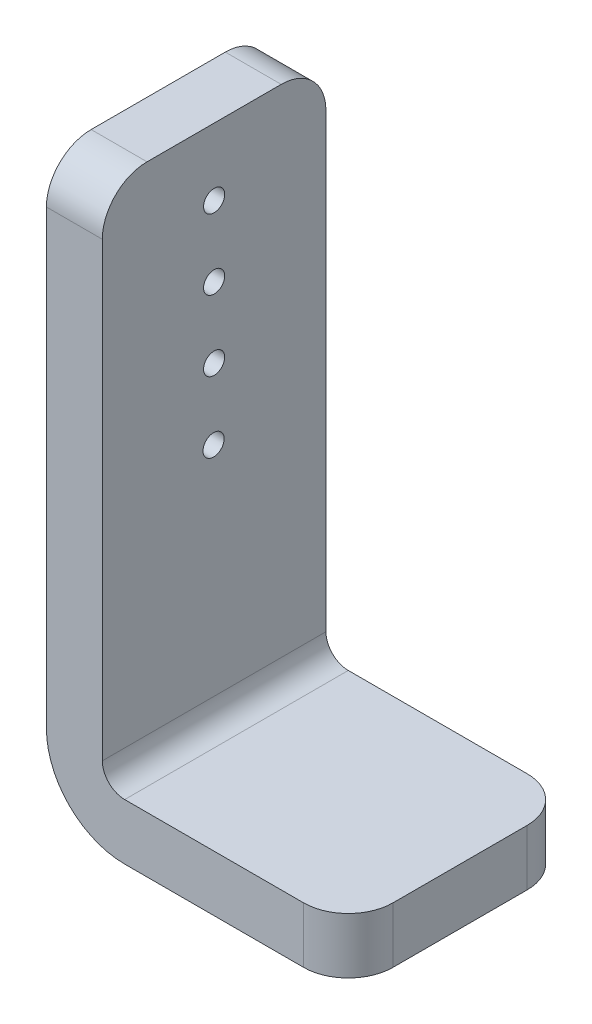
ISO-10303-21;
HEADER;
FILE_DESCRIPTION(('STEP AP214'),'2;1');
FILE_NAME('part.step','',(''),(''),'','','');
FILE_SCHEMA(('AUTOMOTIVE_DESIGN { 1 0 10303 214 1 1 1 1 }'));
ENDSEC;
DATA;
#1=APPLICATION_CONTEXT('core data for automotive mechanical design processes');
#2=APPLICATION_PROTOCOL_DEFINITION('international standard','automotive_design',2000,#1);
#3=PRODUCT_CONTEXT('',#1,'mechanical');
#4=PRODUCT('Part','Part','',(#3));
#5=PRODUCT_RELATED_PRODUCT_CATEGORY('part','',(#4));
#6=PRODUCT_DEFINITION_FORMATION('','',#4);
#7=PRODUCT_DEFINITION_CONTEXT('part definition',#1,'design');
#8=PRODUCT_DEFINITION('design','',#6,#7);
#9=PRODUCT_DEFINITION_SHAPE('','',#8);
#10=(LENGTH_UNIT() NAMED_UNIT(*) SI_UNIT(.MILLI.,.METRE.));
#11=(NAMED_UNIT(*) PLANE_ANGLE_UNIT() SI_UNIT($,.RADIAN.));
#12=(NAMED_UNIT(*) SI_UNIT($,.STERADIAN.) SOLID_ANGLE_UNIT());
#13=UNCERTAINTY_MEASURE_WITH_UNIT(LENGTH_MEASURE(1.E-05),#10,'distance_accuracy_value','');
#14=(GEOMETRIC_REPRESENTATION_CONTEXT(3) GLOBAL_UNCERTAINTY_ASSIGNED_CONTEXT((#13)) GLOBAL_UNIT_ASSIGNED_CONTEXT((#10,
#11,#12)) REPRESENTATION_CONTEXT('',''));
#15=CARTESIAN_POINT('',(0.,0.,0.));
#16=DIRECTION('',(0.,0.,1.));
#17=DIRECTION('',(1.,0.,0.));
#18=AXIS2_PLACEMENT_3D('',#15,#16,#17);
#19=CARTESIAN_POINT('',(0.,16.4758698370056,12.7));
#20=DIRECTION('',(0.,-1.,0.));
#21=DIRECTION('',(0.,0.,-1.));
#22=AXIS2_PLACEMENT_3D('',#19,#20,#21);
#23=PLANE('',#22);
#24=DIRECTION('',(0.,0.,-1.));
#25=VECTOR('',#24,1.);
#26=CARTESIAN_POINT('',(0.,16.4758698370056,12.7));
#27=LINE('',#26,#25);
#28=CARTESIAN_POINT('',(0.,16.4758698370056,10.16));
#29=VERTEX_POINT('',#28);
#30=CARTESIAN_POINT('',(0.,16.4758698370056,2.54));
#31=VERTEX_POINT('',#30);
#32=EDGE_CURVE('E162',#29,#31,#27,.T.);
#33=ORIENTED_EDGE('',*,*,#32,.T.);
#34=DIRECTION('',(-1.,0.,0.));
#35=VECTOR('',#34,1.);
#36=CARTESIAN_POINT('',(-3.175,16.4758698370056,2.54));
#37=LINE('',#36,#35);
#38=CARTESIAN_POINT('',(-3.175,16.4758698370056,2.54));
#39=VERTEX_POINT('',#38);
#40=EDGE_CURVE('E212',#31,#39,#37,.T.);
#41=ORIENTED_EDGE('',*,*,#40,.T.);
#42=DIRECTION('',(0.,0.,-1.));
#43=VECTOR('',#42,1.);
#44=CARTESIAN_POINT('',(-3.175,16.4758698370056,12.7));
#45=LINE('',#44,#43);
#46=CARTESIAN_POINT('',(-3.175,16.4758698370056,10.16));
#47=VERTEX_POINT('',#46);
#48=EDGE_CURVE('E145',#47,#39,#45,.T.);
#49=ORIENTED_EDGE('',*,*,#48,.F.);
#50=DIRECTION('',(-1.,0.,0.));
#51=VECTOR('',#50,1.);
#52=CARTESIAN_POINT('',(0.,16.4758698370056,10.16));
#53=LINE('',#52,#51);
#54=EDGE_CURVE('E55',#47,#29,#53,.F.);
#55=ORIENTED_EDGE('',*,*,#54,.T.);
#56=EDGE_LOOP('',(#33,#41,#49,#55));
#57=FACE_BOUND('',#56,.T.);
#58=ADVANCED_FACE('F35',(#57),#23,.F.);
#59=CARTESIAN_POINT('',(-3.175,16.4758698370056,12.7));
#60=DIRECTION('',(1.,0.,0.));
#61=DIRECTION('',(0.,1.,0.));
#62=AXIS2_PLACEMENT_3D('',#59,#60,#61);
#63=PLANE('',#62);
#64=CARTESIAN_POINT('',(-3.175,12.6658698370056,6.35));
#65=DIRECTION('',(1.,0.,0.));
#66=DIRECTION('',(0.,1.,0.));
#67=AXIS2_PLACEMENT_3D('',#64,#65,#66);
#68=CIRCLE('',#67,0.600000000000019);
#69=CARTESIAN_POINT('',(-3.175,13.2658698370056,6.35));
#70=VERTEX_POINT('',#69);
#71=EDGE_CURVE('E165',#70,#70,#68,.T.);
#72=ORIENTED_EDGE('',*,*,#71,.T.);
#73=EDGE_LOOP('',(#72));
#74=FACE_BOUND('',#73,.T.);
#75=CARTESIAN_POINT('',(-3.175,8.66586983700555,6.35));
#76=DIRECTION('',(1.,0.,0.));
#77=DIRECTION('',(0.,1.,0.));
#78=AXIS2_PLACEMENT_3D('',#75,#76,#77);
#79=CIRCLE('',#78,0.600000000000017);
#80=CARTESIAN_POINT('',(-3.175,9.26586983700556,6.35));
#81=VERTEX_POINT('',#80);
#82=EDGE_CURVE('E424',#81,#81,#79,.T.);
#83=ORIENTED_EDGE('',*,*,#82,.T.);
#84=EDGE_LOOP('',(#83));
#85=FACE_BOUND('',#84,.T.);
#86=CARTESIAN_POINT('',(-3.175,4.66587783700555,6.35));
#87=DIRECTION('',(1.,0.,0.));
#88=DIRECTION('',(0.,1.,0.));
#89=AXIS2_PLACEMENT_3D('',#86,#87,#88);
#90=CIRCLE('',#89,0.600000000000017);
#91=CARTESIAN_POINT('',(-3.175,5.26587783700556,6.35));
#92=VERTEX_POINT('',#91);
#93=EDGE_CURVE('E416',#92,#92,#90,.T.);
#94=ORIENTED_EDGE('',*,*,#93,.T.);
#95=EDGE_LOOP('',(#94));
#96=FACE_BOUND('',#95,.T.);
#97=CARTESIAN_POINT('',(-3.175,0.665885837005546,6.38088664426206));
#98=DIRECTION('',(1.,0.,0.));
#99=DIRECTION('',(0.,1.,0.));
#100=AXIS2_PLACEMENT_3D('',#97,#98,#99);
#101=CIRCLE('',#100,0.600000000000017);
#102=CARTESIAN_POINT('',(-3.175,1.26588583700556,6.38088664426206));
#103=VERTEX_POINT('',#102);
#104=EDGE_CURVE('E411',#103,#103,#101,.T.);
#105=ORIENTED_EDGE('',*,*,#104,.T.);
#106=EDGE_LOOP('',(#105));
#107=FACE_BOUND('',#106,.T.);
#108=ORIENTED_EDGE('',*,*,#48,.T.);
#109=CARTESIAN_POINT('',(-3.175,13.9358698370055,2.54));
#110=DIRECTION('',(1.,0.,0.));
#111=DIRECTION('',(0.,1.,0.));
#112=AXIS2_PLACEMENT_3D('',#109,#110,#111);
#113=CIRCLE('',#112,2.54);
#114=CARTESIAN_POINT('',(-3.175,13.9358698370055,0.));
#115=VERTEX_POINT('',#114);
#116=EDGE_CURVE('E217',#39,#115,#113,.F.);
#117=ORIENTED_EDGE('',*,*,#116,.T.);
#118=DIRECTION('',(0.,-1.,0.));
#119=VECTOR('',#118,1.);
#120=CARTESIAN_POINT('',(-3.175,16.4758698370056,0.));
#121=LINE('',#120,#119);
#122=CARTESIAN_POINT('',(-3.175,-11.7181301629945,0.));
#123=VERTEX_POINT('',#122);
#124=EDGE_CURVE('E142',#115,#123,#121,.T.);
#125=ORIENTED_EDGE('',*,*,#124,.T.);
#126=DIRECTION('',(0.,0.,-1.));
#127=VECTOR('',#126,1.);
#128=CARTESIAN_POINT('',(-3.175,-11.7181301629945,12.7));
#129=LINE('',#128,#127);
#130=CARTESIAN_POINT('',(-3.175,-11.7181301629945,12.7));
#131=VERTEX_POINT('',#130);
#132=EDGE_CURVE('E138',#131,#123,#129,.T.);
#133=ORIENTED_EDGE('',*,*,#132,.F.);
#134=DIRECTION('',(0.,-1.,0.));
#135=VECTOR('',#134,1.);
#136=CARTESIAN_POINT('',(-3.175,16.4758698370056,12.7));
#137=LINE('',#136,#135);
#138=CARTESIAN_POINT('',(-3.175,13.9358698370055,12.7));
#139=VERTEX_POINT('',#138);
#140=EDGE_CURVE('E124',#139,#131,#137,.T.);
#141=ORIENTED_EDGE('',*,*,#140,.F.);
#142=CARTESIAN_POINT('',(-3.175,13.9358698370055,10.16));
#143=DIRECTION('',(1.,0.,0.));
#144=DIRECTION('',(0.,1.,0.));
#145=AXIS2_PLACEMENT_3D('',#142,#143,#144);
#146=CIRCLE('',#145,2.54);
#147=EDGE_CURVE('E215',#139,#47,#146,.F.);
#148=ORIENTED_EDGE('',*,*,#147,.T.);
#149=EDGE_LOOP('',(#108,#117,#125,#133,#141,#148));
#150=FACE_BOUND('',#149,.T.);
#151=ADVANCED_FACE('F140',(#74,#85,#96,#107,#150),#63,.F.);
#152=CARTESIAN_POINT('',(1.27,-11.7181301629945,12.7));
#153=DIRECTION('',(0.,0.,-1.));
#154=DIRECTION('',(-1.,0.,0.));
#155=AXIS2_PLACEMENT_3D('',#152,#153,#154);
#156=CYLINDRICAL_SURFACE('',#155,4.445);
#157=CARTESIAN_POINT('',(1.27,-11.7181301629945,0.));
#158=DIRECTION('',(0.,0.,1.));
#159=DIRECTION('',(-1.,0.,0.));
#160=AXIS2_PLACEMENT_3D('',#157,#158,#159);
#161=CIRCLE('',#160,4.445);
#162=CARTESIAN_POINT('',(1.27,-16.1631301629945,0.));
#163=VERTEX_POINT('',#162);
#164=EDGE_CURVE('E164',#123,#163,#161,.T.);
#165=ORIENTED_EDGE('',*,*,#164,.T.);
#166=DIRECTION('',(0.,0.,-1.));
#167=VECTOR('',#166,1.);
#168=CARTESIAN_POINT('',(1.27,-16.1631301629945,12.7));
#169=LINE('',#168,#167);
#170=CARTESIAN_POINT('',(1.27,-16.1631301629945,12.7));
#171=VERTEX_POINT('',#170);
#172=EDGE_CURVE('E146',#171,#163,#169,.T.);
#173=ORIENTED_EDGE('',*,*,#172,.F.);
#174=CARTESIAN_POINT('',(1.27,-11.7181301629945,12.7));
#175=DIRECTION('',(0.,0.,1.));
#176=DIRECTION('',(-1.,0.,0.));
#177=AXIS2_PLACEMENT_3D('',#174,#175,#176);
#178=CIRCLE('',#177,4.445);
#179=EDGE_CURVE('E129',#131,#171,#178,.T.);
#180=ORIENTED_EDGE('',*,*,#179,.F.);
#181=ORIENTED_EDGE('',*,*,#132,.T.);
#182=EDGE_LOOP('',(#165,#173,#180,#181));
#183=FACE_BOUND('',#182,.T.);
#184=ADVANCED_FACE('F148',(#183),#156,.T.);
#185=CARTESIAN_POINT('',(1.27,-16.1631301629945,12.7));
#186=DIRECTION('',(0.,1.,0.));
#187=DIRECTION('',(0.,0.,1.));
#188=AXIS2_PLACEMENT_3D('',#185,#186,#187);
#189=PLANE('',#188);
#190=DIRECTION('',(1.,0.,0.));
#191=VECTOR('',#190,1.);
#192=CARTESIAN_POINT('',(1.27,-16.1631301629945,0.));
#193=LINE('',#192,#191);
#194=CARTESIAN_POINT('',(11.43,-16.1631301629945,0.));
#195=VERTEX_POINT('',#194);
#196=EDGE_CURVE('E167',#163,#195,#193,.T.);
#197=ORIENTED_EDGE('',*,*,#196,.T.);
#198=CARTESIAN_POINT('',(11.43,-16.1631301629945,2.54));
#199=DIRECTION('',(0.,1.,0.));
#200=DIRECTION('',(0.,0.,1.));
#201=AXIS2_PLACEMENT_3D('',#198,#199,#200);
#202=CIRCLE('',#201,2.54);
#203=CARTESIAN_POINT('',(13.97,-16.1631301629945,2.54));
#204=VERTEX_POINT('',#203);
#205=EDGE_CURVE('E205',#195,#204,#202,.F.);
#206=ORIENTED_EDGE('',*,*,#205,.T.);
#207=DIRECTION('',(0.,0.,-1.));
#208=VECTOR('',#207,1.);
#209=CARTESIAN_POINT('',(13.97,-16.1631301629945,12.7));
#210=LINE('',#209,#208);
#211=CARTESIAN_POINT('',(13.97,-16.1631301629945,10.16));
#212=VERTEX_POINT('',#211);
#213=EDGE_CURVE('E185',#212,#204,#210,.T.);
#214=ORIENTED_EDGE('',*,*,#213,.F.);
#215=CARTESIAN_POINT('',(11.43,-16.1631301629945,10.16));
#216=DIRECTION('',(0.,1.,0.));
#217=DIRECTION('',(0.,0.,1.));
#218=AXIS2_PLACEMENT_3D('',#215,#216,#217);
#219=CIRCLE('',#218,2.54);
#220=CARTESIAN_POINT('',(11.43,-16.1631301629945,12.7));
#221=VERTEX_POINT('',#220);
#222=EDGE_CURVE('E203',#212,#221,#219,.F.);
#223=ORIENTED_EDGE('',*,*,#222,.T.);
#224=DIRECTION('',(1.,0.,0.));
#225=VECTOR('',#224,1.);
#226=CARTESIAN_POINT('',(1.27,-16.1631301629945,12.7));
#227=LINE('',#226,#225);
#228=EDGE_CURVE('E151',#171,#221,#227,.T.);
#229=ORIENTED_EDGE('',*,*,#228,.F.);
#230=ORIENTED_EDGE('',*,*,#172,.T.);
#231=EDGE_LOOP('',(#197,#206,#214,#223,#229,#230));
#232=FACE_BOUND('',#231,.T.);
#233=ADVANCED_FACE('F234',(#232),#189,.F.);
#234=CARTESIAN_POINT('',(13.97,-12.9881301629945,12.7));
#235=DIRECTION('',(-1.,0.,0.));
#236=DIRECTION('',(0.,0.,1.));
#237=AXIS2_PLACEMENT_3D('',#234,#235,#236);
#238=PLANE('',#237);
#239=ORIENTED_EDGE('',*,*,#213,.T.);
#240=DIRECTION('',(0.,1.,0.));
#241=VECTOR('',#240,1.);
#242=CARTESIAN_POINT('',(13.97,-12.9881301629945,2.54));
#243=LINE('',#242,#241);
#244=CARTESIAN_POINT('',(13.97,-12.9881301629945,2.54));
#245=VERTEX_POINT('',#244);
#246=EDGE_CURVE('E192',#204,#245,#243,.T.);
#247=ORIENTED_EDGE('',*,*,#246,.T.);
#248=DIRECTION('',(0.,0.,-1.));
#249=VECTOR('',#248,1.);
#250=CARTESIAN_POINT('',(13.97,-12.9881301629945,12.7));
#251=LINE('',#250,#249);
#252=CARTESIAN_POINT('',(13.97,-12.9881301629945,10.16));
#253=VERTEX_POINT('',#252);
#254=EDGE_CURVE('E182',#253,#245,#251,.T.);
#255=ORIENTED_EDGE('',*,*,#254,.F.);
#256=DIRECTION('',(0.,1.,0.));
#257=VECTOR('',#256,1.);
#258=CARTESIAN_POINT('',(13.97,-12.9881301629945,10.16));
#259=LINE('',#258,#257);
#260=EDGE_CURVE('E190',#253,#212,#259,.F.);
#261=ORIENTED_EDGE('',*,*,#260,.T.);
#262=EDGE_LOOP('',(#239,#247,#255,#261));
#263=FACE_BOUND('',#262,.T.);
#264=ADVANCED_FACE('F248',(#263),#238,.F.);
#265=CARTESIAN_POINT('',(1.27,-12.9881301629945,12.7));
#266=DIRECTION('',(0.,-1.,0.));
#267=DIRECTION('',(1.,0.,0.));
#268=AXIS2_PLACEMENT_3D('',#265,#266,#267);
#269=PLANE('',#268);
#270=ORIENTED_EDGE('',*,*,#254,.T.);
#271=CARTESIAN_POINT('',(11.43,-12.9881301629945,2.54));
#272=DIRECTION('',(0.,-1.,0.));
#273=DIRECTION('',(1.,0.,0.));
#274=AXIS2_PLACEMENT_3D('',#271,#272,#273);
#275=CIRCLE('',#274,2.54);
#276=CARTESIAN_POINT('',(11.43,-12.9881301629945,0.));
#277=VERTEX_POINT('',#276);
#278=EDGE_CURVE('E197',#245,#277,#275,.F.);
#279=ORIENTED_EDGE('',*,*,#278,.T.);
#280=DIRECTION('',(-1.,0.,0.));
#281=VECTOR('',#280,1.);
#282=CARTESIAN_POINT('',(1.27,-12.9881301629945,0.));
#283=LINE('',#282,#281);
#284=CARTESIAN_POINT('',(1.27,-12.9881301629945,0.));
#285=VERTEX_POINT('',#284);
#286=EDGE_CURVE('E170',#277,#285,#283,.T.);
#287=ORIENTED_EDGE('',*,*,#286,.T.);
#288=DIRECTION('',(0.,0.,-1.));
#289=VECTOR('',#288,1.);
#290=CARTESIAN_POINT('',(1.27,-12.9881301629945,12.7));
#291=LINE('',#290,#289);
#292=CARTESIAN_POINT('',(1.27,-12.9881301629945,12.7));
#293=VERTEX_POINT('',#292);
#294=EDGE_CURVE('E179',#293,#285,#291,.T.);
#295=ORIENTED_EDGE('',*,*,#294,.F.);
#296=DIRECTION('',(-1.,0.,0.));
#297=VECTOR('',#296,1.);
#298=CARTESIAN_POINT('',(1.27,-12.9881301629945,12.7));
#299=LINE('',#298,#297);
#300=CARTESIAN_POINT('',(11.43,-12.9881301629945,12.7));
#301=VERTEX_POINT('',#300);
#302=EDGE_CURVE('E153',#301,#293,#299,.T.);
#303=ORIENTED_EDGE('',*,*,#302,.F.);
#304=CARTESIAN_POINT('',(11.43,-12.9881301629945,10.16));
#305=DIRECTION('',(0.,-1.,0.));
#306=DIRECTION('',(1.,0.,0.));
#307=AXIS2_PLACEMENT_3D('',#304,#305,#306);
#308=CIRCLE('',#307,2.54);
#309=EDGE_CURVE('E195',#301,#253,#308,.F.);
#310=ORIENTED_EDGE('',*,*,#309,.T.);
#311=EDGE_LOOP('',(#270,#279,#287,#295,#303,#310));
#312=FACE_BOUND('',#311,.T.);
#313=ADVANCED_FACE('F245',(#312),#269,.F.);
#314=CARTESIAN_POINT('',(1.27,-11.7181301629945,12.7));
#315=DIRECTION('',(0.,0.,-1.));
#316=DIRECTION('',(-1.,0.,0.));
#317=AXIS2_PLACEMENT_3D('',#314,#315,#316);
#318=CYLINDRICAL_SURFACE('',#317,1.27);
#319=CARTESIAN_POINT('',(1.27,-11.7181301629945,0.));
#320=DIRECTION('',(0.,0.,-1.));
#321=DIRECTION('',(-1.,0.,0.));
#322=AXIS2_PLACEMENT_3D('',#319,#320,#321);
#323=CIRCLE('',#322,1.27);
#324=CARTESIAN_POINT('',(0.,-11.7181301629945,0.));
#325=VERTEX_POINT('',#324);
#326=EDGE_CURVE('E172',#285,#325,#323,.T.);
#327=ORIENTED_EDGE('',*,*,#326,.T.);
#328=DIRECTION('',(0.,0.,-1.));
#329=VECTOR('',#328,1.);
#330=CARTESIAN_POINT('',(0.,-11.7181301629945,12.7));
#331=LINE('',#330,#329);
#332=CARTESIAN_POINT('',(0.,-11.7181301629945,12.7));
#333=VERTEX_POINT('',#332);
#334=EDGE_CURVE('E176',#333,#325,#331,.T.);
#335=ORIENTED_EDGE('',*,*,#334,.F.);
#336=CARTESIAN_POINT('',(1.27,-11.7181301629945,12.7));
#337=DIRECTION('',(0.,0.,-1.));
#338=DIRECTION('',(-1.,0.,0.));
#339=AXIS2_PLACEMENT_3D('',#336,#337,#338);
#340=CIRCLE('',#339,1.27);
#341=EDGE_CURVE('E158',#293,#333,#340,.T.);
#342=ORIENTED_EDGE('',*,*,#341,.F.);
#343=ORIENTED_EDGE('',*,*,#294,.T.);
#344=EDGE_LOOP('',(#327,#335,#342,#343));
#345=FACE_BOUND('',#344,.T.);
#346=ADVANCED_FACE('F255',(#345),#318,.F.);
#347=CARTESIAN_POINT('',(0.,16.4758698370056,12.7));
#348=DIRECTION('',(-1.,0.,0.));
#349=DIRECTION('',(0.,-1.,0.));
#350=AXIS2_PLACEMENT_3D('',#347,#348,#349);
#351=PLANE('',#350);
#352=CARTESIAN_POINT('',(0.,12.6658698370056,6.35));
#353=DIRECTION('',(-1.,0.,0.));
#354=DIRECTION('',(0.,-1.,0.));
#355=AXIS2_PLACEMENT_3D('',#352,#353,#354);
#356=CIRCLE('',#355,0.600000000000019);
#357=CARTESIAN_POINT('',(0.,12.0658698370055,6.35));
#358=VERTEX_POINT('',#357);
#359=EDGE_CURVE('E430',#358,#358,#356,.T.);
#360=ORIENTED_EDGE('',*,*,#359,.T.);
#361=EDGE_LOOP('',(#360));
#362=FACE_BOUND('',#361,.T.);
#363=CARTESIAN_POINT('',(0.,8.66586983700555,6.35));
#364=DIRECTION('',(-1.,0.,0.));
#365=DIRECTION('',(0.,-1.,0.));
#366=AXIS2_PLACEMENT_3D('',#363,#364,#365);
#367=CIRCLE('',#366,0.600000000000017);
#368=CARTESIAN_POINT('',(0.,8.06586983700553,6.35));
#369=VERTEX_POINT('',#368);
#370=EDGE_CURVE('E427',#369,#369,#367,.T.);
#371=ORIENTED_EDGE('',*,*,#370,.T.);
#372=EDGE_LOOP('',(#371));
#373=FACE_BOUND('',#372,.T.);
#374=CARTESIAN_POINT('',(0.,4.66587783700555,6.35));
#375=DIRECTION('',(-1.,0.,0.));
#376=DIRECTION('',(0.,-1.,0.));
#377=AXIS2_PLACEMENT_3D('',#374,#375,#376);
#378=CIRCLE('',#377,0.600000000000017);
#379=CARTESIAN_POINT('',(0.,4.06587783700553,6.35));
#380=VERTEX_POINT('',#379);
#381=EDGE_CURVE('E419',#380,#380,#378,.T.);
#382=ORIENTED_EDGE('',*,*,#381,.T.);
#383=EDGE_LOOP('',(#382));
#384=FACE_BOUND('',#383,.T.);
#385=CARTESIAN_POINT('',(0.,0.665885837005545,6.38088664426206));
#386=DIRECTION('',(-1.,0.,0.));
#387=DIRECTION('',(0.,-1.,0.));
#388=AXIS2_PLACEMENT_3D('',#385,#386,#387);
#389=CIRCLE('',#388,0.600000000000017);
#390=CARTESIAN_POINT('',(0.,0.0658858370055288,6.38088664426206));
#391=VERTEX_POINT('',#390);
#392=EDGE_CURVE('E414',#391,#391,#389,.T.);
#393=ORIENTED_EDGE('',*,*,#392,.T.);
#394=EDGE_LOOP('',(#393));
#395=FACE_BOUND('',#394,.T.);
#396=DIRECTION('',(0.,1.,0.));
#397=VECTOR('',#396,1.);
#398=CARTESIAN_POINT('',(0.,16.4758698370056,0.));
#399=LINE('',#398,#397);
#400=CARTESIAN_POINT('',(0.,13.9358698370055,0.));
#401=VERTEX_POINT('',#400);
#402=EDGE_CURVE('E135',#325,#401,#399,.T.);
#403=ORIENTED_EDGE('',*,*,#402,.T.);
#404=CARTESIAN_POINT('',(0.,13.9358698370055,2.54));
#405=DIRECTION('',(-1.,0.,0.));
#406=DIRECTION('',(0.,-1.,0.));
#407=AXIS2_PLACEMENT_3D('',#404,#405,#406);
#408=CIRCLE('',#407,2.54);
#409=EDGE_CURVE('E11',#401,#31,#408,.F.);
#410=ORIENTED_EDGE('',*,*,#409,.T.);
#411=ORIENTED_EDGE('',*,*,#32,.F.);
#412=CARTESIAN_POINT('',(0.,13.9358698370055,10.16));
#413=DIRECTION('',(-1.,0.,0.));
#414=DIRECTION('',(0.,-1.,0.));
#415=AXIS2_PLACEMENT_3D('',#412,#413,#414);
#416=CIRCLE('',#415,2.54);
#417=CARTESIAN_POINT('',(0.,13.9358698370055,12.7));
#418=VERTEX_POINT('',#417);
#419=EDGE_CURVE('E43',#29,#418,#416,.F.);
#420=ORIENTED_EDGE('',*,*,#419,.T.);
#421=DIRECTION('',(0.,1.,0.));
#422=VECTOR('',#421,1.);
#423=CARTESIAN_POINT('',(0.,16.4758698370056,12.7));
#424=LINE('',#423,#422);
#425=EDGE_CURVE('E160',#333,#418,#424,.T.);
#426=ORIENTED_EDGE('',*,*,#425,.F.);
#427=ORIENTED_EDGE('',*,*,#334,.T.);
#428=EDGE_LOOP('',(#403,#410,#411,#420,#426,#427));
#429=FACE_BOUND('',#428,.T.);
#430=ADVANCED_FACE('F220',(#362,#373,#384,#395,#429),#351,.F.);
#431=CARTESIAN_POINT('',(1.27,-11.7181301629945,12.7));
#432=DIRECTION('',(0.,0.,-1.));
#433=DIRECTION('',(-1.,0.,0.));
#434=AXIS2_PLACEMENT_3D('',#431,#432,#433);
#435=PLANE('',#434);
#436=ORIENTED_EDGE('',*,*,#228,.T.);
#437=DIRECTION('',(0.,1.,0.));
#438=VECTOR('',#437,1.);
#439=CARTESIAN_POINT('',(11.43,-11.7181301629945,12.7));
#440=LINE('',#439,#438);
#441=EDGE_CURVE('E208',#221,#301,#440,.T.);
#442=ORIENTED_EDGE('',*,*,#441,.T.);
#443=ORIENTED_EDGE('',*,*,#302,.T.);
#444=ORIENTED_EDGE('',*,*,#341,.T.);
#445=ORIENTED_EDGE('',*,*,#425,.T.);
#446=DIRECTION('',(-1.,0.,0.));
#447=VECTOR('',#446,1.);
#448=CARTESIAN_POINT('',(1.27,13.9358698370055,12.7));
#449=LINE('',#448,#447);
#450=EDGE_CURVE('E133',#418,#139,#449,.T.);
#451=ORIENTED_EDGE('',*,*,#450,.T.);
#452=ORIENTED_EDGE('',*,*,#140,.T.);
#453=ORIENTED_EDGE('',*,*,#179,.T.);
#454=EDGE_LOOP('',(#436,#442,#443,#444,#445,#451,#452,#453));
#455=FACE_BOUND('',#454,.T.);
#456=ADVANCED_FACE('F127',(#455),#435,.F.);
#457=CARTESIAN_POINT('',(1.27,-11.7181301629945,0.));
#458=DIRECTION('',(0.,0.,-1.));
#459=DIRECTION('',(-1.,0.,0.));
#460=AXIS2_PLACEMENT_3D('',#457,#458,#459);
#461=PLANE('',#460);
#462=ORIENTED_EDGE('',*,*,#286,.F.);
#463=DIRECTION('',(0.,1.,0.));
#464=VECTOR('',#463,1.);
#465=CARTESIAN_POINT('',(11.43,-16.1631301629945,0.));
#466=LINE('',#465,#464);
#467=EDGE_CURVE('E201',#277,#195,#466,.F.);
#468=ORIENTED_EDGE('',*,*,#467,.T.);
#469=ORIENTED_EDGE('',*,*,#196,.F.);
#470=ORIENTED_EDGE('',*,*,#164,.F.);
#471=ORIENTED_EDGE('',*,*,#124,.F.);
#472=DIRECTION('',(-1.,0.,0.));
#473=VECTOR('',#472,1.);
#474=CARTESIAN_POINT('',(0.,13.9358698370055,0.));
#475=LINE('',#474,#473);
#476=EDGE_CURVE('E199',#115,#401,#475,.F.);
#477=ORIENTED_EDGE('',*,*,#476,.T.);
#478=ORIENTED_EDGE('',*,*,#402,.F.);
#479=ORIENTED_EDGE('',*,*,#326,.F.);
#480=EDGE_LOOP('',(#462,#468,#469,#470,#471,#477,#478,#479));
#481=FACE_BOUND('',#480,.T.);
#482=ADVANCED_FACE('F230',(#481),#461,.T.);
#483=CARTESIAN_POINT('',(13.971,0.665885837005544,6.38088664426206));
#484=DIRECTION('',(-1.,0.,0.));
#485=DIRECTION('',(0.,-1.,0.));
#486=AXIS2_PLACEMENT_3D('',#483,#484,#485);
#487=CYLINDRICAL_SURFACE('',#486,0.600000000000017);
#488=ORIENTED_EDGE('',*,*,#104,.F.);
#489=EDGE_LOOP('',(#488));
#490=FACE_BOUND('',#489,.T.);
#491=ORIENTED_EDGE('',*,*,#392,.F.);
#492=EDGE_LOOP('',(#491));
#493=FACE_BOUND('',#492,.T.);
#494=ADVANCED_FACE('F311',(#490,#493),#487,.F.);
#495=CARTESIAN_POINT('',(13.971,4.66587783700554,6.35));
#496=DIRECTION('',(-1.,0.,0.));
#497=DIRECTION('',(0.,-1.,0.));
#498=AXIS2_PLACEMENT_3D('',#495,#496,#497);
#499=CYLINDRICAL_SURFACE('',#498,0.600000000000017);
#500=ORIENTED_EDGE('',*,*,#93,.F.);
#501=EDGE_LOOP('',(#500));
#502=FACE_BOUND('',#501,.T.);
#503=ORIENTED_EDGE('',*,*,#381,.F.);
#504=EDGE_LOOP('',(#503));
#505=FACE_BOUND('',#504,.T.);
#506=ADVANCED_FACE('F379',(#502,#505),#499,.F.);
#507=CARTESIAN_POINT('',(13.971,8.66586983700554,6.35));
#508=DIRECTION('',(-1.,0.,0.));
#509=DIRECTION('',(0.,-1.,0.));
#510=AXIS2_PLACEMENT_3D('',#507,#508,#509);
#511=CYLINDRICAL_SURFACE('',#510,0.600000000000017);
#512=ORIENTED_EDGE('',*,*,#82,.F.);
#513=EDGE_LOOP('',(#512));
#514=FACE_BOUND('',#513,.T.);
#515=ORIENTED_EDGE('',*,*,#370,.F.);
#516=EDGE_LOOP('',(#515));
#517=FACE_BOUND('',#516,.T.);
#518=ADVANCED_FACE('F369',(#514,#517),#511,.F.);
#519=CARTESIAN_POINT('',(13.971,12.6658698370055,6.35));
#520=DIRECTION('',(-1.,0.,0.));
#521=DIRECTION('',(0.,-1.,0.));
#522=AXIS2_PLACEMENT_3D('',#519,#520,#521);
#523=CYLINDRICAL_SURFACE('',#522,0.600000000000019);
#524=ORIENTED_EDGE('',*,*,#71,.F.);
#525=EDGE_LOOP('',(#524));
#526=FACE_BOUND('',#525,.T.);
#527=ORIENTED_EDGE('',*,*,#359,.F.);
#528=EDGE_LOOP('',(#527));
#529=FACE_BOUND('',#528,.T.);
#530=ADVANCED_FACE('F276',(#526,#529),#523,.F.);
#531=CARTESIAN_POINT('',(11.43,-12.9881301629945,2.54));
#532=DIRECTION('',(0.,-1.,0.));
#533=DIRECTION('',(0.,0.,-1.));
#534=AXIS2_PLACEMENT_3D('',#531,#532,#533);
#535=CYLINDRICAL_SURFACE('',#534,2.54);
#536=ORIENTED_EDGE('',*,*,#205,.F.);
#537=ORIENTED_EDGE('',*,*,#467,.F.);
#538=ORIENTED_EDGE('',*,*,#278,.F.);
#539=ORIENTED_EDGE('',*,*,#246,.F.);
#540=EDGE_LOOP('',(#536,#537,#538,#539));
#541=FACE_BOUND('',#540,.T.);
#542=ADVANCED_FACE('F251',(#541),#535,.T.);
#543=CARTESIAN_POINT('',(11.43,-11.7181301629945,10.16));
#544=DIRECTION('',(0.,1.,0.));
#545=DIRECTION('',(0.,0.,1.));
#546=AXIS2_PLACEMENT_3D('',#543,#544,#545);
#547=CYLINDRICAL_SURFACE('',#546,2.54);
#548=ORIENTED_EDGE('',*,*,#222,.F.);
#549=ORIENTED_EDGE('',*,*,#260,.F.);
#550=ORIENTED_EDGE('',*,*,#309,.F.);
#551=ORIENTED_EDGE('',*,*,#441,.F.);
#552=EDGE_LOOP('',(#548,#549,#550,#551));
#553=FACE_BOUND('',#552,.T.);
#554=ADVANCED_FACE('F241',(#553),#547,.T.);
#555=CARTESIAN_POINT('',(0.,13.9358698370055,2.54));
#556=DIRECTION('',(1.,0.,0.));
#557=DIRECTION('',(0.,0.,-1.));
#558=AXIS2_PLACEMENT_3D('',#555,#556,#557);
#559=CYLINDRICAL_SURFACE('',#558,2.54);
#560=ORIENTED_EDGE('',*,*,#409,.F.);
#561=ORIENTED_EDGE('',*,*,#476,.F.);
#562=ORIENTED_EDGE('',*,*,#116,.F.);
#563=ORIENTED_EDGE('',*,*,#40,.F.);
#564=EDGE_LOOP('',(#560,#561,#562,#563));
#565=FACE_BOUND('',#564,.T.);
#566=ADVANCED_FACE('F226',(#565),#559,.T.);
#567=CARTESIAN_POINT('',(1.27,13.9358698370055,10.16));
#568=DIRECTION('',(-1.,0.,0.));
#569=DIRECTION('',(0.,0.,1.));
#570=AXIS2_PLACEMENT_3D('',#567,#568,#569);
#571=CYLINDRICAL_SURFACE('',#570,2.54);
#572=ORIENTED_EDGE('',*,*,#419,.F.);
#573=ORIENTED_EDGE('',*,*,#54,.F.);
#574=ORIENTED_EDGE('',*,*,#147,.F.);
#575=ORIENTED_EDGE('',*,*,#450,.F.);
#576=EDGE_LOOP('',(#572,#573,#574,#575));
#577=FACE_BOUND('',#576,.T.);
#578=ADVANCED_FACE('F37',(#577),#571,.T.);
#579=CLOSED_SHELL('',(#58,#151,#184,#233,#264,#313,#346,#430,#456,#482,#494,#506,#518,#530,#542,
#554,#566,#578));
#580=MANIFOLD_SOLID_BREP('B2',#579);
#581=ADVANCED_BREP_SHAPE_REPRESENTATION('',(#18,#580),#14);
#582=SHAPE_DEFINITION_REPRESENTATION(#9,#581);
ENDSEC;
END-ISO-10303-21;
